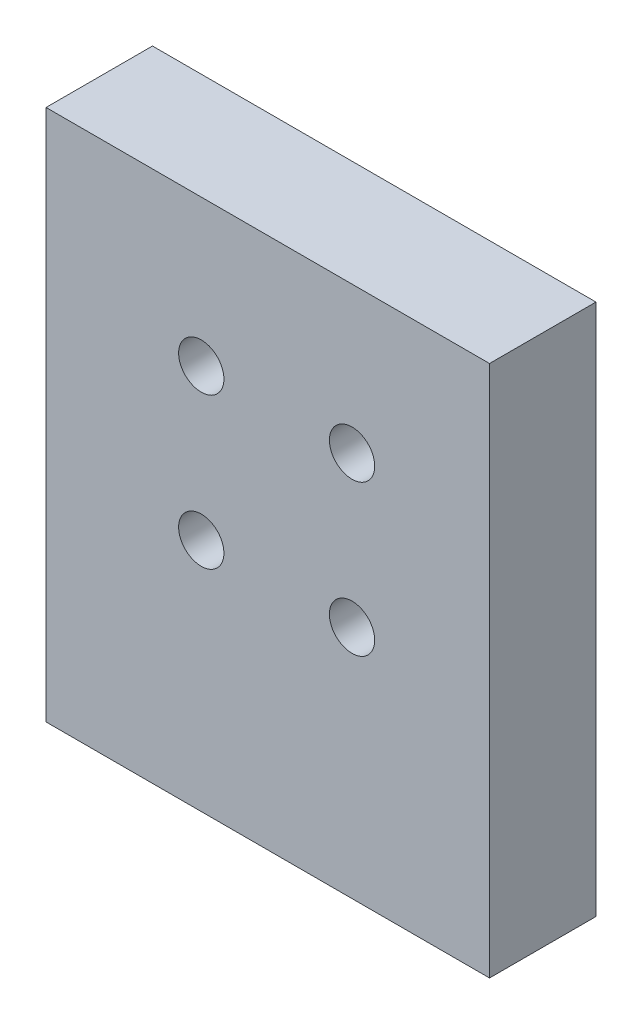
ISO-10303-21;
HEADER;
FILE_DESCRIPTION(('STEP AP214'),'2;1');
FILE_NAME('part.step','',(''),(''),'','','');
FILE_SCHEMA(('AUTOMOTIVE_DESIGN { 1 0 10303 214 1 1 1 1 }'));
ENDSEC;
DATA;
#1=APPLICATION_CONTEXT('core data for automotive mechanical design processes');
#2=APPLICATION_PROTOCOL_DEFINITION('international standard','automotive_design',2000,#1);
#3=PRODUCT_CONTEXT('',#1,'mechanical');
#4=PRODUCT('Part','Part','',(#3));
#5=PRODUCT_RELATED_PRODUCT_CATEGORY('part','',(#4));
#6=PRODUCT_DEFINITION_FORMATION('','',#4);
#7=PRODUCT_DEFINITION_CONTEXT('part definition',#1,'design');
#8=PRODUCT_DEFINITION('design','',#6,#7);
#9=PRODUCT_DEFINITION_SHAPE('','',#8);
#10=(LENGTH_UNIT() NAMED_UNIT(*) SI_UNIT(.MILLI.,.METRE.));
#11=(NAMED_UNIT(*) PLANE_ANGLE_UNIT() SI_UNIT($,.RADIAN.));
#12=(NAMED_UNIT(*) SI_UNIT($,.STERADIAN.) SOLID_ANGLE_UNIT());
#13=UNCERTAINTY_MEASURE_WITH_UNIT(LENGTH_MEASURE(1.E-05),#10,'distance_accuracy_value','');
#14=(GEOMETRIC_REPRESENTATION_CONTEXT(3) GLOBAL_UNCERTAINTY_ASSIGNED_CONTEXT((#13)) GLOBAL_UNIT_ASSIGNED_CONTEXT((#10,
#11,#12)) REPRESENTATION_CONTEXT('',''));
#15=CARTESIAN_POINT('',(0.,0.,0.));
#16=DIRECTION('',(0.,0.,1.));
#17=DIRECTION('',(1.,0.,0.));
#18=AXIS2_PLACEMENT_3D('',#15,#16,#17);
#19=CARTESIAN_POINT('',(25.,30.,12.));
#20=DIRECTION('',(1.,0.,0.));
#21=DIRECTION('',(0.,1.,0.));
#22=AXIS2_PLACEMENT_3D('',#19,#20,#21);
#23=PLANE('',#22);
#24=DIRECTION('',(0.,-1.,0.));
#25=VECTOR('',#24,1.);
#26=CARTESIAN_POINT('',(25.,30.,0.));
#27=LINE('',#26,#25);
#28=CARTESIAN_POINT('',(25.,30.,0.));
#29=VERTEX_POINT('',#28);
#30=CARTESIAN_POINT('',(25.,-30.,0.));
#31=VERTEX_POINT('',#30);
#32=EDGE_CURVE('E140',#29,#31,#27,.T.);
#33=ORIENTED_EDGE('',*,*,#32,.F.);
#34=DIRECTION('',(0.,0.,-1.));
#35=VECTOR('',#34,1.);
#36=CARTESIAN_POINT('',(25.,30.,12.));
#37=LINE('',#36,#35);
#38=CARTESIAN_POINT('',(25.,30.,12.));
#39=VERTEX_POINT('',#38);
#40=EDGE_CURVE('E11',#39,#29,#37,.T.);
#41=ORIENTED_EDGE('',*,*,#40,.F.);
#42=DIRECTION('',(0.,-1.,0.));
#43=VECTOR('',#42,1.);
#44=CARTESIAN_POINT('',(25.,30.,12.));
#45=LINE('',#44,#43);
#46=CARTESIAN_POINT('',(25.,-30.,12.));
#47=VERTEX_POINT('',#46);
#48=EDGE_CURVE('E141',#39,#47,#45,.T.);
#49=ORIENTED_EDGE('',*,*,#48,.T.);
#50=DIRECTION('',(0.,0.,-1.));
#51=VECTOR('',#50,1.);
#52=CARTESIAN_POINT('',(25.,-30.,12.));
#53=LINE('',#52,#51);
#54=EDGE_CURVE('E82',#47,#31,#53,.T.);
#55=ORIENTED_EDGE('',*,*,#54,.T.);
#56=EDGE_LOOP('',(#33,#41,#49,#55));
#57=FACE_BOUND('',#56,.T.);
#58=ADVANCED_FACE('F40',(#57),#23,.T.);
#59=CARTESIAN_POINT('',(25.,30.,12.));
#60=DIRECTION('',(0.,-1.,0.));
#61=DIRECTION('',(1.,0.,0.));
#62=AXIS2_PLACEMENT_3D('',#59,#60,#61);
#63=PLANE('',#62);
#64=DIRECTION('',(-1.,0.,0.));
#65=VECTOR('',#64,1.);
#66=CARTESIAN_POINT('',(25.,30.,0.));
#67=LINE('',#66,#65);
#68=CARTESIAN_POINT('',(-25.,30.,0.));
#69=VERTEX_POINT('',#68);
#70=EDGE_CURVE('E74',#29,#69,#67,.T.);
#71=ORIENTED_EDGE('',*,*,#70,.T.);
#72=DIRECTION('',(0.,0.,-1.));
#73=VECTOR('',#72,1.);
#74=CARTESIAN_POINT('',(-25.,30.,12.));
#75=LINE('',#74,#73);
#76=CARTESIAN_POINT('',(-25.,30.,12.));
#77=VERTEX_POINT('',#76);
#78=EDGE_CURVE('E49',#77,#69,#75,.T.);
#79=ORIENTED_EDGE('',*,*,#78,.F.);
#80=DIRECTION('',(-1.,0.,0.));
#81=VECTOR('',#80,1.);
#82=CARTESIAN_POINT('',(25.,30.,12.));
#83=LINE('',#82,#81);
#84=EDGE_CURVE('E147',#39,#77,#83,.T.);
#85=ORIENTED_EDGE('',*,*,#84,.F.);
#86=ORIENTED_EDGE('',*,*,#40,.T.);
#87=EDGE_LOOP('',(#71,#79,#85,#86));
#88=FACE_BOUND('',#87,.T.);
#89=ADVANCED_FACE('F183',(#88),#63,.F.);
#90=CARTESIAN_POINT('',(-25.,30.,12.));
#91=DIRECTION('',(1.,0.,0.));
#92=DIRECTION('',(0.,1.,0.));
#93=AXIS2_PLACEMENT_3D('',#90,#91,#92);
#94=PLANE('',#93);
#95=DIRECTION('',(0.,-1.,0.));
#96=VECTOR('',#95,1.);
#97=CARTESIAN_POINT('',(-25.,30.,0.));
#98=LINE('',#97,#96);
#99=CARTESIAN_POINT('',(-25.,-30.,0.));
#100=VERTEX_POINT('',#99);
#101=EDGE_CURVE('E154',#69,#100,#98,.T.);
#102=ORIENTED_EDGE('',*,*,#101,.T.);
#103=DIRECTION('',(0.,0.,-1.));
#104=VECTOR('',#103,1.);
#105=CARTESIAN_POINT('',(-25.,-30.,12.));
#106=LINE('',#105,#104);
#107=CARTESIAN_POINT('',(-25.,-30.,12.));
#108=VERTEX_POINT('',#107);
#109=EDGE_CURVE('E159',#108,#100,#106,.T.);
#110=ORIENTED_EDGE('',*,*,#109,.F.);
#111=DIRECTION('',(0.,-1.,0.));
#112=VECTOR('',#111,1.);
#113=CARTESIAN_POINT('',(-25.,30.,12.));
#114=LINE('',#113,#112);
#115=EDGE_CURVE('E145',#77,#108,#114,.T.);
#116=ORIENTED_EDGE('',*,*,#115,.F.);
#117=ORIENTED_EDGE('',*,*,#78,.T.);
#118=EDGE_LOOP('',(#102,#110,#116,#117));
#119=FACE_BOUND('',#118,.T.);
#120=ADVANCED_FACE('F182',(#119),#94,.F.);
#121=CARTESIAN_POINT('',(25.,-30.,12.));
#122=DIRECTION('',(0.,-1.,0.));
#123=DIRECTION('',(1.,0.,0.));
#124=AXIS2_PLACEMENT_3D('',#121,#122,#123);
#125=PLANE('',#124);
#126=CARTESIAN_POINT('',(-15.,-30.,6.));
#127=DIRECTION('',(0.,-1.,0.));
#128=DIRECTION('',(0.,0.,-1.));
#129=AXIS2_PLACEMENT_3D('',#126,#127,#128);
#130=CIRCLE('',#129,1.7272);
#131=CARTESIAN_POINT('',(-15.,-30.,4.2728));
#132=VERTEX_POINT('',#131);
#133=EDGE_CURVE('E105',#132,#132,#130,.T.);
#134=ORIENTED_EDGE('',*,*,#133,.F.);
#135=EDGE_LOOP('',(#134));
#136=FACE_BOUND('',#135,.T.);
#137=CARTESIAN_POINT('',(0.,-30.,6.));
#138=DIRECTION('',(0.,-1.,0.));
#139=DIRECTION('',(0.,0.,-1.));
#140=AXIS2_PLACEMENT_3D('',#137,#138,#139);
#141=CIRCLE('',#140,1.7272);
#142=CARTESIAN_POINT('',(0.,-30.,4.2728));
#143=VERTEX_POINT('',#142);
#144=EDGE_CURVE('E104',#143,#143,#141,.T.);
#145=ORIENTED_EDGE('',*,*,#144,.F.);
#146=EDGE_LOOP('',(#145));
#147=FACE_BOUND('',#146,.T.);
#148=CARTESIAN_POINT('',(15.,-30.,6.));
#149=DIRECTION('',(0.,-1.,0.));
#150=DIRECTION('',(0.,0.,-1.));
#151=AXIS2_PLACEMENT_3D('',#148,#149,#150);
#152=CIRCLE('',#151,1.7272);
#153=CARTESIAN_POINT('',(15.,-30.,4.2728));
#154=VERTEX_POINT('',#153);
#155=EDGE_CURVE('E115',#154,#154,#152,.T.);
#156=ORIENTED_EDGE('',*,*,#155,.F.);
#157=EDGE_LOOP('',(#156));
#158=FACE_BOUND('',#157,.T.);
#159=DIRECTION('',(-1.,0.,0.));
#160=VECTOR('',#159,1.);
#161=CARTESIAN_POINT('',(25.,-30.,0.));
#162=LINE('',#161,#160);
#163=EDGE_CURVE('E151',#31,#100,#162,.T.);
#164=ORIENTED_EDGE('',*,*,#163,.F.);
#165=ORIENTED_EDGE('',*,*,#54,.F.);
#166=DIRECTION('',(-1.,0.,0.));
#167=VECTOR('',#166,1.);
#168=CARTESIAN_POINT('',(25.,-30.,12.));
#169=LINE('',#168,#167);
#170=EDGE_CURVE('E143',#47,#108,#169,.T.);
#171=ORIENTED_EDGE('',*,*,#170,.T.);
#172=ORIENTED_EDGE('',*,*,#109,.T.);
#173=EDGE_LOOP('',(#164,#165,#171,#172));
#174=FACE_BOUND('',#173,.T.);
#175=ADVANCED_FACE('F178',(#136,#147,#158,#174),#125,.T.);
#176=CARTESIAN_POINT('',(0.,0.,12.));
#177=DIRECTION('',(0.,0.,-1.));
#178=DIRECTION('',(-1.,0.,0.));
#179=AXIS2_PLACEMENT_3D('',#176,#177,#178);
#180=PLANE('',#179);
#181=CARTESIAN_POINT('',(-7.5,13.5,12.));
#182=DIRECTION('',(0.,0.,1.));
#183=DIRECTION('',(1.,0.,0.));
#184=AXIS2_PLACEMENT_3D('',#181,#182,#183);
#185=CIRCLE('',#184,2.5527);
#186=CARTESIAN_POINT('',(-4.9473,13.5,12.));
#187=VERTEX_POINT('',#186);
#188=EDGE_CURVE('E121',#187,#187,#185,.T.);
#189=ORIENTED_EDGE('',*,*,#188,.F.);
#190=EDGE_LOOP('',(#189));
#191=FACE_BOUND('',#190,.T.);
#192=CARTESIAN_POINT('',(9.5,13.5,12.));
#193=DIRECTION('',(0.,0.,1.));
#194=DIRECTION('',(1.,0.,0.));
#195=AXIS2_PLACEMENT_3D('',#192,#193,#194);
#196=CIRCLE('',#195,2.5527);
#197=CARTESIAN_POINT('',(12.0527,13.5,12.));
#198=VERTEX_POINT('',#197);
#199=EDGE_CURVE('E124',#198,#198,#196,.T.);
#200=ORIENTED_EDGE('',*,*,#199,.F.);
#201=EDGE_LOOP('',(#200));
#202=FACE_BOUND('',#201,.T.);
#203=CARTESIAN_POINT('',(9.5,-3.49999999999999,12.));
#204=DIRECTION('',(0.,0.,1.));
#205=DIRECTION('',(1.,0.,0.));
#206=AXIS2_PLACEMENT_3D('',#203,#204,#205);
#207=CIRCLE('',#206,2.5527);
#208=CARTESIAN_POINT('',(12.0527,-3.49999999999999,12.));
#209=VERTEX_POINT('',#208);
#210=EDGE_CURVE('E130',#209,#209,#207,.T.);
#211=ORIENTED_EDGE('',*,*,#210,.F.);
#212=EDGE_LOOP('',(#211));
#213=FACE_BOUND('',#212,.T.);
#214=CARTESIAN_POINT('',(-7.5,-3.49999999999999,12.));
#215=DIRECTION('',(0.,0.,1.));
#216=DIRECTION('',(1.,0.,0.));
#217=AXIS2_PLACEMENT_3D('',#214,#215,#216);
#218=CIRCLE('',#217,2.5527);
#219=CARTESIAN_POINT('',(-4.9473,-3.49999999999999,12.));
#220=VERTEX_POINT('',#219);
#221=EDGE_CURVE('E134',#220,#220,#218,.T.);
#222=ORIENTED_EDGE('',*,*,#221,.F.);
#223=EDGE_LOOP('',(#222));
#224=FACE_BOUND('',#223,.T.);
#225=ORIENTED_EDGE('',*,*,#48,.F.);
#226=ORIENTED_EDGE('',*,*,#84,.T.);
#227=ORIENTED_EDGE('',*,*,#115,.T.);
#228=ORIENTED_EDGE('',*,*,#170,.F.);
#229=EDGE_LOOP('',(#225,#226,#227,#228));
#230=FACE_BOUND('',#229,.T.);
#231=ADVANCED_FACE('F171',(#191,#202,#213,#224,#230),#180,.F.);
#232=CARTESIAN_POINT('',(0.,0.,0.));
#233=DIRECTION('',(0.,0.,-1.));
#234=DIRECTION('',(-1.,0.,0.));
#235=AXIS2_PLACEMENT_3D('',#232,#233,#234);
#236=PLANE('',#235);
#237=CARTESIAN_POINT('',(-7.5,13.5,0.));
#238=DIRECTION('',(0.,0.,-1.));
#239=DIRECTION('',(-1.,0.,0.));
#240=AXIS2_PLACEMENT_3D('',#237,#238,#239);
#241=CIRCLE('',#240,2.5527);
#242=CARTESIAN_POINT('',(-10.0527,13.5,0.));
#243=VERTEX_POINT('',#242);
#244=EDGE_CURVE('E43',#243,#243,#241,.T.);
#245=ORIENTED_EDGE('',*,*,#244,.F.);
#246=EDGE_LOOP('',(#245));
#247=FACE_BOUND('',#246,.T.);
#248=CARTESIAN_POINT('',(9.5,13.5,0.));
#249=DIRECTION('',(0.,0.,-1.));
#250=DIRECTION('',(-1.,0.,0.));
#251=AXIS2_PLACEMENT_3D('',#248,#249,#250);
#252=CIRCLE('',#251,2.5527);
#253=CARTESIAN_POINT('',(6.9473,13.5,0.));
#254=VERTEX_POINT('',#253);
#255=EDGE_CURVE('E127',#254,#254,#252,.T.);
#256=ORIENTED_EDGE('',*,*,#255,.F.);
#257=EDGE_LOOP('',(#256));
#258=FACE_BOUND('',#257,.T.);
#259=CARTESIAN_POINT('',(9.5,-3.49999999999999,0.));
#260=DIRECTION('',(0.,0.,-1.));
#261=DIRECTION('',(-1.,0.,0.));
#262=AXIS2_PLACEMENT_3D('',#259,#260,#261);
#263=CIRCLE('',#262,2.5527);
#264=CARTESIAN_POINT('',(6.9473,-3.49999999999999,0.));
#265=VERTEX_POINT('',#264);
#266=EDGE_CURVE('E133',#265,#265,#263,.T.);
#267=ORIENTED_EDGE('',*,*,#266,.F.);
#268=EDGE_LOOP('',(#267));
#269=FACE_BOUND('',#268,.T.);
#270=CARTESIAN_POINT('',(-7.5,-3.49999999999999,0.));
#271=DIRECTION('',(0.,0.,-1.));
#272=DIRECTION('',(-1.,0.,0.));
#273=AXIS2_PLACEMENT_3D('',#270,#271,#272);
#274=CIRCLE('',#273,2.5527);
#275=CARTESIAN_POINT('',(-10.0527,-3.49999999999999,0.));
#276=VERTEX_POINT('',#275);
#277=EDGE_CURVE('E137',#276,#276,#274,.T.);
#278=ORIENTED_EDGE('',*,*,#277,.F.);
#279=EDGE_LOOP('',(#278));
#280=FACE_BOUND('',#279,.T.);
#281=ORIENTED_EDGE('',*,*,#32,.T.);
#282=ORIENTED_EDGE('',*,*,#163,.T.);
#283=ORIENTED_EDGE('',*,*,#101,.F.);
#284=ORIENTED_EDGE('',*,*,#70,.F.);
#285=EDGE_LOOP('',(#281,#282,#283,#284));
#286=FACE_BOUND('',#285,.T.);
#287=ADVANCED_FACE('F167',(#247,#258,#269,#280,#286),#236,.T.);
#288=CARTESIAN_POINT('',(-7.5,-3.49999999999999,12.));
#289=DIRECTION('',(0.,0.,1.));
#290=DIRECTION('',(1.,0.,0.));
#291=AXIS2_PLACEMENT_3D('',#288,#289,#290);
#292=CYLINDRICAL_SURFACE('',#291,2.5527);
#293=ORIENTED_EDGE('',*,*,#277,.T.);
#294=EDGE_LOOP('',(#293));
#295=FACE_BOUND('',#294,.T.);
#296=ORIENTED_EDGE('',*,*,#221,.T.);
#297=EDGE_LOOP('',(#296));
#298=FACE_BOUND('',#297,.T.);
#299=ADVANCED_FACE('F170',(#295,#298),#292,.F.);
#300=CARTESIAN_POINT('',(9.5,-3.49999999999999,12.));
#301=DIRECTION('',(0.,0.,1.));
#302=DIRECTION('',(1.,0.,0.));
#303=AXIS2_PLACEMENT_3D('',#300,#301,#302);
#304=CYLINDRICAL_SURFACE('',#303,2.5527);
#305=ORIENTED_EDGE('',*,*,#266,.T.);
#306=EDGE_LOOP('',(#305));
#307=FACE_BOUND('',#306,.T.);
#308=ORIENTED_EDGE('',*,*,#210,.T.);
#309=EDGE_LOOP('',(#308));
#310=FACE_BOUND('',#309,.T.);
#311=ADVANCED_FACE('F164',(#307,#310),#304,.F.);
#312=CARTESIAN_POINT('',(9.5,13.5,12.));
#313=DIRECTION('',(0.,0.,1.));
#314=DIRECTION('',(1.,0.,0.));
#315=AXIS2_PLACEMENT_3D('',#312,#313,#314);
#316=CYLINDRICAL_SURFACE('',#315,2.5527);
#317=ORIENTED_EDGE('',*,*,#255,.T.);
#318=EDGE_LOOP('',(#317));
#319=FACE_BOUND('',#318,.T.);
#320=ORIENTED_EDGE('',*,*,#199,.T.);
#321=EDGE_LOOP('',(#320));
#322=FACE_BOUND('',#321,.T.);
#323=ADVANCED_FACE('F291',(#319,#322),#316,.F.);
#324=CARTESIAN_POINT('',(-7.5,13.5,12.));
#325=DIRECTION('',(0.,0.,1.));
#326=DIRECTION('',(1.,0.,0.));
#327=AXIS2_PLACEMENT_3D('',#324,#325,#326);
#328=CYLINDRICAL_SURFACE('',#327,2.5527);
#329=ORIENTED_EDGE('',*,*,#244,.T.);
#330=EDGE_LOOP('',(#329));
#331=FACE_BOUND('',#330,.T.);
#332=ORIENTED_EDGE('',*,*,#188,.T.);
#333=EDGE_LOOP('',(#332));
#334=FACE_BOUND('',#333,.T.);
#335=ADVANCED_FACE('F217',(#331,#334),#328,.F.);
#336=CARTESIAN_POINT('',(15.,-17.3,6.));
#337=DIRECTION('',(0.,-1.,0.));
#338=DIRECTION('',(0.,0.,-1.));
#339=AXIS2_PLACEMENT_3D('',#336,#337,#338);
#340=CONICAL_SURFACE('',#339,1.7272,1.02974425867665);
#341=CARTESIAN_POINT('',(15.,-16.2621935388156,6.));
#342=VERTEX_POINT('',#341);
#343=VERTEX_LOOP('',#342);
#344=FACE_BOUND('',#343,.T.);
#345=CARTESIAN_POINT('',(15.,-17.3,6.));
#346=DIRECTION('',(0.,-1.,0.));
#347=DIRECTION('',(0.,0.,-1.));
#348=AXIS2_PLACEMENT_3D('',#345,#346,#347);
#349=CIRCLE('',#348,1.7272);
#350=CARTESIAN_POINT('',(15.,-17.3,4.2728));
#351=VERTEX_POINT('',#350);
#352=EDGE_CURVE('E118',#351,#351,#349,.T.);
#353=ORIENTED_EDGE('',*,*,#352,.T.);
#354=EDGE_LOOP('',(#353));
#355=FACE_BOUND('',#354,.T.);
#356=ADVANCED_FACE('F222',(#344,#355),#340,.F.);
#357=CARTESIAN_POINT('',(15.,-30.,6.));
#358=DIRECTION('',(0.,-1.,0.));
#359=DIRECTION('',(0.,0.,-1.));
#360=AXIS2_PLACEMENT_3D('',#357,#358,#359);
#361=CYLINDRICAL_SURFACE('',#360,1.7272);
#362=ORIENTED_EDGE('',*,*,#352,.F.);
#363=EDGE_LOOP('',(#362));
#364=FACE_BOUND('',#363,.T.);
#365=ORIENTED_EDGE('',*,*,#155,.T.);
#366=EDGE_LOOP('',(#365));
#367=FACE_BOUND('',#366,.T.);
#368=ADVANCED_FACE('F227',(#364,#367),#361,.F.);
#369=CARTESIAN_POINT('',(0.,-17.3,6.));
#370=DIRECTION('',(0.,-1.,0.));
#371=DIRECTION('',(0.,0.,-1.));
#372=AXIS2_PLACEMENT_3D('',#369,#370,#371);
#373=CONICAL_SURFACE('',#372,1.7272,1.02974425867665);
#374=CARTESIAN_POINT('',(0.,-16.2621935388156,6.));
#375=VERTEX_POINT('',#374);
#376=VERTEX_LOOP('',#375);
#377=FACE_BOUND('',#376,.T.);
#378=CARTESIAN_POINT('',(0.,-17.3,6.));
#379=DIRECTION('',(0.,-1.,0.));
#380=DIRECTION('',(0.,0.,-1.));
#381=AXIS2_PLACEMENT_3D('',#378,#379,#380);
#382=CIRCLE('',#381,1.7272);
#383=CARTESIAN_POINT('',(0.,-17.3,4.2728));
#384=VERTEX_POINT('',#383);
#385=EDGE_CURVE('E108',#384,#384,#382,.T.);
#386=ORIENTED_EDGE('',*,*,#385,.T.);
#387=EDGE_LOOP('',(#386));
#388=FACE_BOUND('',#387,.T.);
#389=ADVANCED_FACE('F239',(#377,#388),#373,.F.);
#390=CARTESIAN_POINT('',(0.,-30.,6.));
#391=DIRECTION('',(0.,-1.,0.));
#392=DIRECTION('',(0.,0.,-1.));
#393=AXIS2_PLACEMENT_3D('',#390,#391,#392);
#394=CYLINDRICAL_SURFACE('',#393,1.7272);
#395=ORIENTED_EDGE('',*,*,#385,.F.);
#396=EDGE_LOOP('',(#395));
#397=FACE_BOUND('',#396,.T.);
#398=ORIENTED_EDGE('',*,*,#144,.T.);
#399=EDGE_LOOP('',(#398));
#400=FACE_BOUND('',#399,.T.);
#401=ADVANCED_FACE('F98',(#397,#400),#394,.F.);
#402=CARTESIAN_POINT('',(-15.,-17.3,6.));
#403=DIRECTION('',(0.,-1.,0.));
#404=DIRECTION('',(0.,0.,-1.));
#405=AXIS2_PLACEMENT_3D('',#402,#403,#404);
#406=CONICAL_SURFACE('',#405,1.7272,1.02974425867665);
#407=CARTESIAN_POINT('',(-15.,-16.2621935388156,6.));
#408=VERTEX_POINT('',#407);
#409=VERTEX_LOOP('',#408);
#410=FACE_BOUND('',#409,.T.);
#411=CARTESIAN_POINT('',(-15.,-17.3,6.));
#412=DIRECTION('',(0.,-1.,0.));
#413=DIRECTION('',(0.,0.,-1.));
#414=AXIS2_PLACEMENT_3D('',#411,#412,#413);
#415=CIRCLE('',#414,1.7272);
#416=CARTESIAN_POINT('',(-15.,-17.3,4.2728));
#417=VERTEX_POINT('',#416);
#418=EDGE_CURVE('E102',#417,#417,#415,.T.);
#419=ORIENTED_EDGE('',*,*,#418,.T.);
#420=EDGE_LOOP('',(#419));
#421=FACE_BOUND('',#420,.T.);
#422=ADVANCED_FACE('F94',(#410,#421),#406,.F.);
#423=CARTESIAN_POINT('',(-15.,-30.,6.));
#424=DIRECTION('',(0.,-1.,0.));
#425=DIRECTION('',(0.,0.,-1.));
#426=AXIS2_PLACEMENT_3D('',#423,#424,#425);
#427=CYLINDRICAL_SURFACE('',#426,1.7272);
#428=ORIENTED_EDGE('',*,*,#418,.F.);
#429=EDGE_LOOP('',(#428));
#430=FACE_BOUND('',#429,.T.);
#431=ORIENTED_EDGE('',*,*,#133,.T.);
#432=EDGE_LOOP('',(#431));
#433=FACE_BOUND('',#432,.T.);
#434=ADVANCED_FACE('F97',(#430,#433),#427,.F.);
#435=CLOSED_SHELL('',(#58,#89,#120,#175,#231,#287,#299,#311,#323,#335,#356,#368,#389,#401,#422,#434));
#436=MANIFOLD_SOLID_BREP('B2',#435);
#437=ADVANCED_BREP_SHAPE_REPRESENTATION('',(#18,#436),#14);
#438=SHAPE_DEFINITION_REPRESENTATION(#9,#437);
ENDSEC;
END-ISO-10303-21;
